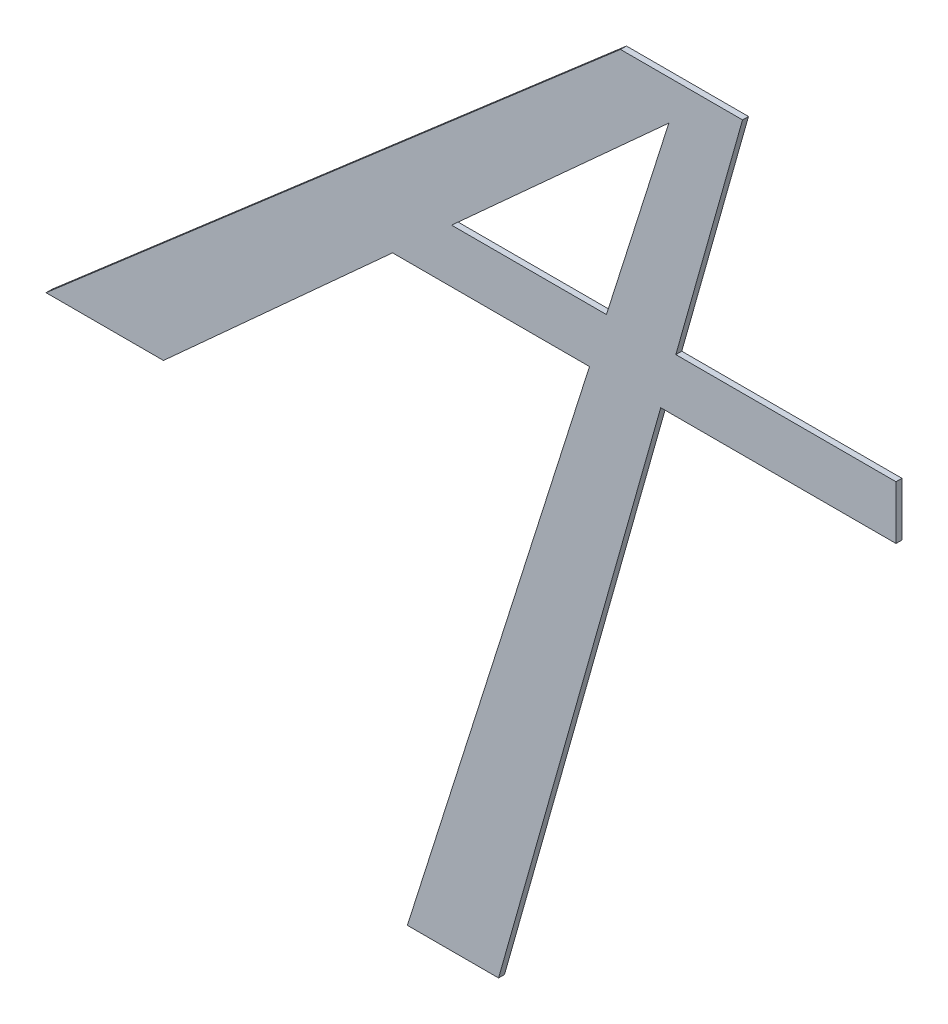
ISO-10303-21;
HEADER;
FILE_DESCRIPTION(('STEP AP214'),'2;1');
FILE_NAME('part.step','',(''),(''),'','','');
FILE_SCHEMA(('AUTOMOTIVE_DESIGN { 1 0 10303 214 1 1 1 1 }'));
ENDSEC;
DATA;
#1=APPLICATION_CONTEXT('core data for automotive mechanical design processes');
#2=APPLICATION_PROTOCOL_DEFINITION('international standard','automotive_design',2000,#1);
#3=PRODUCT_CONTEXT('',#1,'mechanical');
#4=PRODUCT('Part','Part','',(#3));
#5=PRODUCT_RELATED_PRODUCT_CATEGORY('part','',(#4));
#6=PRODUCT_DEFINITION_FORMATION('','',#4);
#7=PRODUCT_DEFINITION_CONTEXT('part definition',#1,'design');
#8=PRODUCT_DEFINITION('design','',#6,#7);
#9=PRODUCT_DEFINITION_SHAPE('','',#8);
#10=(LENGTH_UNIT() NAMED_UNIT(*) SI_UNIT(.MILLI.,.METRE.));
#11=(NAMED_UNIT(*) PLANE_ANGLE_UNIT() SI_UNIT($,.RADIAN.));
#12=(NAMED_UNIT(*) SI_UNIT($,.STERADIAN.) SOLID_ANGLE_UNIT());
#13=UNCERTAINTY_MEASURE_WITH_UNIT(LENGTH_MEASURE(1.E-05),#10,'distance_accuracy_value','');
#14=(GEOMETRIC_REPRESENTATION_CONTEXT(3) GLOBAL_UNCERTAINTY_ASSIGNED_CONTEXT((#13)) GLOBAL_UNIT_ASSIGNED_CONTEXT((#10,
#11,#12)) REPRESENTATION_CONTEXT('',''));
#15=CARTESIAN_POINT('',(0.,0.,0.));
#16=DIRECTION('',(0.,0.,1.));
#17=DIRECTION('',(1.,0.,0.));
#18=AXIS2_PLACEMENT_3D('',#15,#16,#17);
#19=CARTESIAN_POINT('',(0.734443929948458,0.979436457466031,0.));
#20=DIRECTION('',(-0.953321534290562,0.301957037106092,0.));
#21=DIRECTION('',(-0.301957037106092,-0.953321534290562,0.));
#22=AXIS2_PLACEMENT_3D('',#19,#20,#21);
#23=PLANE('',#22);
#24=DIRECTION('',(-0.301957037106092,-0.953321534290562,0.));
#25=VECTOR('',#24,1.);
#26=CARTESIAN_POINT('',(0.734443929948458,0.979436457466031,0.));
#27=LINE('',#26,#25);
#28=CARTESIAN_POINT('',(0.734443929948458,0.979436457466031,0.));
#29=VERTEX_POINT('',#28);
#30=CARTESIAN_POINT('',(0.702959405727164,0.880035313433387,0.));
#31=VERTEX_POINT('',#30);
#32=EDGE_CURVE('E11',#29,#31,#27,.T.);
#33=ORIENTED_EDGE('',*,*,#32,.T.);
#34=DIRECTION('',(0.,0.,1.));
#35=VECTOR('',#34,1.);
#36=CARTESIAN_POINT('',(0.702959405727164,0.880035313433387,0.));
#37=LINE('',#36,#35);
#38=CARTESIAN_POINT('',(0.702959405727164,0.880035313433387,0.003));
#39=VERTEX_POINT('',#38);
#40=EDGE_CURVE('E24',#31,#39,#37,.T.);
#41=ORIENTED_EDGE('',*,*,#40,.T.);
#42=DIRECTION('',(-0.301957037106092,-0.953321534290562,0.));
#43=VECTOR('',#42,1.);
#44=CARTESIAN_POINT('',(0.734443929948458,0.979436457466031,0.003));
#45=LINE('',#44,#43);
#46=CARTESIAN_POINT('',(0.734443929948458,0.979436457466031,0.003));
#47=VERTEX_POINT('',#46);
#48=EDGE_CURVE('E253',#47,#39,#45,.T.);
#49=ORIENTED_EDGE('',*,*,#48,.F.);
#50=DIRECTION('',(0.,0.,1.));
#51=VECTOR('',#50,1.);
#52=CARTESIAN_POINT('',(0.734443929948458,0.979436457466031,0.));
#53=LINE('',#52,#51);
#54=EDGE_CURVE('E250',#29,#47,#53,.T.);
#55=ORIENTED_EDGE('',*,*,#54,.F.);
#56=EDGE_LOOP('',(#33,#41,#49,#55));
#57=FACE_BOUND('',#56,.T.);
#58=ADVANCED_FACE('F17',(#57),#23,.T.);
#59=CARTESIAN_POINT('',(0.624826562522376,0.880035313433387,0.));
#60=DIRECTION('',(0.671743526448324,-0.740783797524467,0.));
#61=DIRECTION('',(0.740783797524467,0.671743526448324,0.));
#62=AXIS2_PLACEMENT_3D('',#59,#60,#61);
#63=PLANE('',#62);
#64=DIRECTION('',(0.740783797524467,0.671743526448324,0.));
#65=VECTOR('',#64,1.);
#66=CARTESIAN_POINT('',(0.624826562522376,0.880035313433387,0.));
#67=LINE('',#66,#65);
#68=CARTESIAN_POINT('',(0.624826562522376,0.880035313433387,0.));
#69=VERTEX_POINT('',#68);
#70=EDGE_CURVE('E247',#69,#29,#67,.T.);
#71=ORIENTED_EDGE('',*,*,#70,.T.);
#72=ORIENTED_EDGE('',*,*,#54,.T.);
#73=DIRECTION('',(0.740783797524467,0.671743526448324,0.));
#74=VECTOR('',#73,1.);
#75=CARTESIAN_POINT('',(0.624826562522376,0.880035313433387,0.003));
#76=LINE('',#75,#74);
#77=CARTESIAN_POINT('',(0.624826562522376,0.880035313433387,0.003));
#78=VERTEX_POINT('',#77);
#79=EDGE_CURVE('E244',#78,#47,#76,.T.);
#80=ORIENTED_EDGE('',*,*,#79,.F.);
#81=DIRECTION('',(0.,0.,1.));
#82=VECTOR('',#81,1.);
#83=CARTESIAN_POINT('',(0.624826562522376,0.880035313433387,0.));
#84=LINE('',#83,#82);
#85=EDGE_CURVE('E241',#69,#78,#84,.T.);
#86=ORIENTED_EDGE('',*,*,#85,.F.);
#87=EDGE_LOOP('',(#71,#72,#80,#86));
#88=FACE_BOUND('',#87,.T.);
#89=ADVANCED_FACE('F260',(#88),#63,.T.);
#90=CARTESIAN_POINT('',(0.702959405727164,0.880035313433387,0.));
#91=DIRECTION('',(0.,1.,0.));
#92=DIRECTION('',(-1.,0.,0.));
#93=AXIS2_PLACEMENT_3D('',#90,#91,#92);
#94=PLANE('',#93);
#95=DIRECTION('',(-1.,0.,0.));
#96=VECTOR('',#95,1.);
#97=CARTESIAN_POINT('',(0.702959405727164,0.880035313433387,0.));
#98=LINE('',#97,#96);
#99=EDGE_CURVE('E238',#31,#69,#98,.T.);
#100=ORIENTED_EDGE('',*,*,#99,.T.);
#101=ORIENTED_EDGE('',*,*,#85,.T.);
#102=DIRECTION('',(-1.,0.,0.));
#103=VECTOR('',#102,1.);
#104=CARTESIAN_POINT('',(0.702959405727164,0.880035313433387,0.003));
#105=LINE('',#104,#103);
#106=EDGE_CURVE('E235',#39,#78,#105,.T.);
#107=ORIENTED_EDGE('',*,*,#106,.F.);
#108=ORIENTED_EDGE('',*,*,#40,.F.);
#109=EDGE_LOOP('',(#100,#101,#107,#108));
#110=FACE_BOUND('',#109,.T.);
#111=ADVANCED_FACE('F257',(#110),#94,.T.);
#112=CARTESIAN_POINT('',(0.420226385774534,0.748221017829747,0.));
#113=DIRECTION('',(0.,-1.,0.));
#114=DIRECTION('',(1.,0.,0.));
#115=AXIS2_PLACEMENT_3D('',#112,#113,#114);
#116=PLANE('',#115);
#117=DIRECTION('',(1.,0.,0.));
#118=VECTOR('',#117,1.);
#119=CARTESIAN_POINT('',(0.420226385774534,0.748221017829747,0.));
#120=LINE('',#119,#118);
#121=CARTESIAN_POINT('',(0.420226385774534,0.748221017829747,0.));
#122=VERTEX_POINT('',#121);
#123=CARTESIAN_POINT('',(0.479464693563916,0.748221017829747,0.));
#124=VERTEX_POINT('',#123);
#125=EDGE_CURVE('E233',#122,#124,#120,.T.);
#126=ORIENTED_EDGE('',*,*,#125,.T.);
#127=DIRECTION('',(0.,0.,1.));
#128=VECTOR('',#127,1.);
#129=CARTESIAN_POINT('',(0.479464693563916,0.748221017829747,0.));
#130=LINE('',#129,#128);
#131=CARTESIAN_POINT('',(0.479464693563916,0.748221017829747,0.003));
#132=VERTEX_POINT('',#131);
#133=EDGE_CURVE('E231',#124,#132,#130,.T.);
#134=ORIENTED_EDGE('',*,*,#133,.T.);
#135=DIRECTION('',(1.,0.,0.));
#136=VECTOR('',#135,1.);
#137=CARTESIAN_POINT('',(0.420226385774534,0.748221017829747,0.003));
#138=LINE('',#137,#136);
#139=CARTESIAN_POINT('',(0.420226385774534,0.748221017829747,0.003));
#140=VERTEX_POINT('',#139);
#141=EDGE_CURVE('E145',#140,#132,#138,.T.);
#142=ORIENTED_EDGE('',*,*,#141,.F.);
#143=DIRECTION('',(0.,0.,1.));
#144=VECTOR('',#143,1.);
#145=CARTESIAN_POINT('',(0.420226385774534,0.748221017829747,0.));
#146=LINE('',#145,#144);
#147=EDGE_CURVE('E227',#122,#140,#146,.T.);
#148=ORIENTED_EDGE('',*,*,#147,.F.);
#149=EDGE_LOOP('',(#126,#134,#142,#148));
#150=FACE_BOUND('',#149,.T.);
#151=ADVANCED_FACE('F277',(#150),#116,.T.);
#152=CARTESIAN_POINT('',(0.71005307485505,0.999422094205851,0.));
#153=DIRECTION('',(-0.65495725832153,0.75566592471273,0.));
#154=DIRECTION('',(-0.75566592471273,-0.65495725832153,0.));
#155=AXIS2_PLACEMENT_3D('',#152,#153,#154);
#156=PLANE('',#155);
#157=DIRECTION('',(-0.75566592471273,-0.65495725832153,0.));
#158=VECTOR('',#157,1.);
#159=CARTESIAN_POINT('',(0.71005307485505,0.999422094205851,0.));
#160=LINE('',#159,#158);
#161=CARTESIAN_POINT('',(0.71005307485505,0.999422094205851,0.));
#162=VERTEX_POINT('',#161);
#163=EDGE_CURVE('E224',#162,#122,#160,.T.);
#164=ORIENTED_EDGE('',*,*,#163,.T.);
#165=ORIENTED_EDGE('',*,*,#147,.T.);
#166=DIRECTION('',(-0.75566592471273,-0.65495725832153,0.));
#167=VECTOR('',#166,1.);
#168=CARTESIAN_POINT('',(0.71005307485505,0.999422094205851,0.003));
#169=LINE('',#168,#167);
#170=CARTESIAN_POINT('',(0.71005307485505,0.999422094205851,0.003));
#171=VERTEX_POINT('',#170);
#172=EDGE_CURVE('E222',#171,#140,#169,.T.);
#173=ORIENTED_EDGE('',*,*,#172,.F.);
#174=DIRECTION('',(0.,0.,1.));
#175=VECTOR('',#174,1.);
#176=CARTESIAN_POINT('',(0.71005307485505,0.999422094205851,0.));
#177=LINE('',#176,#175);
#178=EDGE_CURVE('E219',#162,#171,#177,.T.);
#179=ORIENTED_EDGE('',*,*,#178,.F.);
#180=EDGE_LOOP('',(#164,#165,#173,#179));
#181=FACE_BOUND('',#180,.T.);
#182=ADVANCED_FACE('F282',(#181),#156,.T.);
#183=CARTESIAN_POINT('',(0.771627709888207,0.999422094205851,0.));
#184=DIRECTION('',(0.,1.,0.));
#185=DIRECTION('',(-1.,0.,0.));
#186=AXIS2_PLACEMENT_3D('',#183,#184,#185);
#187=PLANE('',#186);
#188=DIRECTION('',(-1.,0.,0.));
#189=VECTOR('',#188,1.);
#190=CARTESIAN_POINT('',(0.771627709888207,0.999422094205851,0.));
#191=LINE('',#190,#189);
#192=CARTESIAN_POINT('',(0.771627709888207,0.999422094205851,0.));
#193=VERTEX_POINT('',#192);
#194=EDGE_CURVE('E216',#193,#162,#191,.T.);
#195=ORIENTED_EDGE('',*,*,#194,.T.);
#196=ORIENTED_EDGE('',*,*,#178,.T.);
#197=DIRECTION('',(-1.,0.,0.));
#198=VECTOR('',#197,1.);
#199=CARTESIAN_POINT('',(0.771627709888207,0.999422094205851,0.003));
#200=LINE('',#199,#198);
#201=CARTESIAN_POINT('',(0.771627709888207,0.999422094205851,0.003));
#202=VERTEX_POINT('',#201);
#203=EDGE_CURVE('E213',#202,#171,#200,.T.);
#204=ORIENTED_EDGE('',*,*,#203,.F.);
#205=DIRECTION('',(0.,0.,1.));
#206=VECTOR('',#205,1.);
#207=CARTESIAN_POINT('',(0.771627709888207,0.999422094205851,0.));
#208=LINE('',#207,#206);
#209=EDGE_CURVE('E210',#193,#202,#208,.T.);
#210=ORIENTED_EDGE('',*,*,#209,.F.);
#211=EDGE_LOOP('',(#195,#196,#204,#210));
#212=FACE_BOUND('',#211,.T.);
#213=ADVANCED_FACE('F286',(#212),#187,.T.);
#214=CARTESIAN_POINT('',(0.737959586089509,0.880035313433387,0.));
#215=DIRECTION('',(0.962460355588359,-0.271422298127346,0.));
#216=DIRECTION('',(0.271422298127346,0.962460355588359,0.));
#217=AXIS2_PLACEMENT_3D('',#214,#215,#216);
#218=PLANE('',#217);
#219=DIRECTION('',(0.271422298127346,0.962460355588359,0.));
#220=VECTOR('',#219,1.);
#221=CARTESIAN_POINT('',(0.737959586089509,0.880035313433387,0.));
#222=LINE('',#221,#220);
#223=CARTESIAN_POINT('',(0.737959586089509,0.880035313433387,0.));
#224=VERTEX_POINT('',#223);
#225=EDGE_CURVE('E207',#224,#193,#222,.T.);
#226=ORIENTED_EDGE('',*,*,#225,.T.);
#227=ORIENTED_EDGE('',*,*,#209,.T.);
#228=DIRECTION('',(0.271422298127346,0.962460355588359,0.));
#229=VECTOR('',#228,1.);
#230=CARTESIAN_POINT('',(0.737959586089509,0.880035313433387,0.003));
#231=LINE('',#230,#229);
#232=CARTESIAN_POINT('',(0.737959586089509,0.880035313433387,0.003));
#233=VERTEX_POINT('',#232);
#234=EDGE_CURVE('E204',#233,#202,#231,.T.);
#235=ORIENTED_EDGE('',*,*,#234,.F.);
#236=DIRECTION('',(0.,0.,1.));
#237=VECTOR('',#236,1.);
#238=CARTESIAN_POINT('',(0.737959586089509,0.880035313433387,0.));
#239=LINE('',#238,#237);
#240=EDGE_CURVE('E201',#224,#233,#239,.T.);
#241=ORIENTED_EDGE('',*,*,#240,.F.);
#242=EDGE_LOOP('',(#226,#227,#235,#241));
#243=FACE_BOUND('',#242,.T.);
#244=ADVANCED_FACE('F290',(#243),#218,.T.);
#245=CARTESIAN_POINT('',(0.849057169386125,0.880035313433387,0.));
#246=DIRECTION('',(0.,1.,0.));
#247=DIRECTION('',(-1.,0.,0.));
#248=AXIS2_PLACEMENT_3D('',#245,#246,#247);
#249=PLANE('',#248);
#250=DIRECTION('',(-1.,0.,0.));
#251=VECTOR('',#250,1.);
#252=CARTESIAN_POINT('',(0.849057169386125,0.880035313433387,0.));
#253=LINE('',#252,#251);
#254=CARTESIAN_POINT('',(0.849057169386125,0.880035313433387,0.));
#255=VERTEX_POINT('',#254);
#256=EDGE_CURVE('E198',#255,#224,#253,.T.);
#257=ORIENTED_EDGE('',*,*,#256,.T.);
#258=ORIENTED_EDGE('',*,*,#240,.T.);
#259=DIRECTION('',(-1.,0.,0.));
#260=VECTOR('',#259,1.);
#261=CARTESIAN_POINT('',(0.849057169386125,0.880035313433387,0.003));
#262=LINE('',#261,#260);
#263=CARTESIAN_POINT('',(0.849057169386125,0.880035313433387,0.003));
#264=VERTEX_POINT('',#263);
#265=EDGE_CURVE('E195',#264,#233,#262,.T.);
#266=ORIENTED_EDGE('',*,*,#265,.F.);
#267=DIRECTION('',(0.,0.,1.));
#268=VECTOR('',#267,1.);
#269=CARTESIAN_POINT('',(0.849057169386125,0.880035313433387,0.));
#270=LINE('',#269,#268);
#271=EDGE_CURVE('E192',#255,#264,#270,.T.);
#272=ORIENTED_EDGE('',*,*,#271,.F.);
#273=EDGE_LOOP('',(#257,#258,#266,#272));
#274=FACE_BOUND('',#273,.T.);
#275=ADVANCED_FACE('F294',(#274),#249,.T.);
#276=CARTESIAN_POINT('',(0.849057169386125,0.853043530084776,0.));
#277=DIRECTION('',(1.,0.,0.));
#278=DIRECTION('',(0.,1.,0.));
#279=AXIS2_PLACEMENT_3D('',#276,#277,#278);
#280=PLANE('',#279);
#281=DIRECTION('',(0.,1.,0.));
#282=VECTOR('',#281,1.);
#283=CARTESIAN_POINT('',(0.849057169386125,0.853043530084776,0.));
#284=LINE('',#283,#282);
#285=CARTESIAN_POINT('',(0.849057169386125,0.853043530084776,0.));
#286=VERTEX_POINT('',#285);
#287=EDGE_CURVE('E189',#286,#255,#284,.T.);
#288=ORIENTED_EDGE('',*,*,#287,.T.);
#289=ORIENTED_EDGE('',*,*,#271,.T.);
#290=DIRECTION('',(0.,1.,0.));
#291=VECTOR('',#290,1.);
#292=CARTESIAN_POINT('',(0.849057169386125,0.853043530084776,0.003));
#293=LINE('',#292,#291);
#294=CARTESIAN_POINT('',(0.849057169386125,0.853043530084776,0.003));
#295=VERTEX_POINT('',#294);
#296=EDGE_CURVE('E186',#295,#264,#293,.T.);
#297=ORIENTED_EDGE('',*,*,#296,.F.);
#298=DIRECTION('',(0.,0.,1.));
#299=VECTOR('',#298,1.);
#300=CARTESIAN_POINT('',(0.849057169386125,0.853043530084776,0.));
#301=LINE('',#300,#299);
#302=EDGE_CURVE('E183',#286,#295,#301,.T.);
#303=ORIENTED_EDGE('',*,*,#302,.F.);
#304=EDGE_LOOP('',(#288,#289,#297,#303));
#305=FACE_BOUND('',#304,.T.);
#306=ADVANCED_FACE('F298',(#305),#280,.T.);
#307=CARTESIAN_POINT('',(0.730347665427526,0.853043530084776,0.));
#308=DIRECTION('',(0.,-1.,0.));
#309=DIRECTION('',(1.,0.,0.));
#310=AXIS2_PLACEMENT_3D('',#307,#308,#309);
#311=PLANE('',#310);
#312=DIRECTION('',(1.,0.,0.));
#313=VECTOR('',#312,1.);
#314=CARTESIAN_POINT('',(0.730347665427526,0.853043530084776,0.));
#315=LINE('',#314,#313);
#316=CARTESIAN_POINT('',(0.730347665427526,0.853043530084776,0.));
#317=VERTEX_POINT('',#316);
#318=EDGE_CURVE('E180',#317,#286,#315,.T.);
#319=ORIENTED_EDGE('',*,*,#318,.T.);
#320=ORIENTED_EDGE('',*,*,#302,.T.);
#321=DIRECTION('',(1.,0.,0.));
#322=VECTOR('',#321,1.);
#323=CARTESIAN_POINT('',(0.730347665427526,0.853043530084776,0.003));
#324=LINE('',#323,#322);
#325=CARTESIAN_POINT('',(0.730347665427526,0.853043530084776,0.003));
#326=VERTEX_POINT('',#325);
#327=EDGE_CURVE('E177',#326,#295,#324,.T.);
#328=ORIENTED_EDGE('',*,*,#327,.F.);
#329=DIRECTION('',(0.,0.,1.));
#330=VECTOR('',#329,1.);
#331=CARTESIAN_POINT('',(0.730347665427526,0.853043530084776,0.));
#332=LINE('',#331,#330);
#333=EDGE_CURVE('E174',#317,#326,#332,.T.);
#334=ORIENTED_EDGE('',*,*,#333,.F.);
#335=EDGE_LOOP('',(#319,#320,#328,#334));
#336=FACE_BOUND('',#335,.T.);
#337=ADVANCED_FACE('F302',(#336),#311,.T.);
#338=CARTESIAN_POINT('',(0.64853792646181,0.562947134177794,0.));
#339=DIRECTION('',(0.962460355588358,-0.271422298127349,0.));
#340=DIRECTION('',(0.271422298127349,0.962460355588358,0.));
#341=AXIS2_PLACEMENT_3D('',#338,#339,#340);
#342=PLANE('',#341);
#343=DIRECTION('',(0.271422298127349,0.962460355588358,0.));
#344=VECTOR('',#343,1.);
#345=CARTESIAN_POINT('',(0.64853792646181,0.562947134177794,0.));
#346=LINE('',#345,#344);
#347=CARTESIAN_POINT('',(0.64853792646181,0.562947134177794,0.));
#348=VERTEX_POINT('',#347);
#349=EDGE_CURVE('E171',#348,#317,#346,.T.);
#350=ORIENTED_EDGE('',*,*,#349,.T.);
#351=ORIENTED_EDGE('',*,*,#333,.T.);
#352=DIRECTION('',(0.271422298127349,0.962460355588358,0.));
#353=VECTOR('',#352,1.);
#354=CARTESIAN_POINT('',(0.64853792646181,0.562947134177794,0.003));
#355=LINE('',#354,#353);
#356=CARTESIAN_POINT('',(0.64853792646181,0.562947134177794,0.003));
#357=VERTEX_POINT('',#356);
#358=EDGE_CURVE('E168',#357,#326,#355,.T.);
#359=ORIENTED_EDGE('',*,*,#358,.F.);
#360=DIRECTION('',(0.,0.,1.));
#361=VECTOR('',#360,1.);
#362=CARTESIAN_POINT('',(0.64853792646181,0.562947134177794,0.));
#363=LINE('',#362,#361);
#364=EDGE_CURVE('E165',#348,#357,#363,.T.);
#365=ORIENTED_EDGE('',*,*,#364,.F.);
#366=EDGE_LOOP('',(#350,#351,#359,#365));
#367=FACE_BOUND('',#366,.T.);
#368=ADVANCED_FACE('F306',(#367),#342,.T.);
#369=CARTESIAN_POINT('',(0.602524239138127,0.562947134177794,0.));
#370=DIRECTION('',(0.,-1.,0.));
#371=DIRECTION('',(1.,0.,0.));
#372=AXIS2_PLACEMENT_3D('',#369,#370,#371);
#373=PLANE('',#372);
#374=DIRECTION('',(1.,0.,0.));
#375=VECTOR('',#374,1.);
#376=CARTESIAN_POINT('',(0.602524239138127,0.562947134177794,0.));
#377=LINE('',#376,#375);
#378=CARTESIAN_POINT('',(0.602524239138127,0.562947134177794,0.));
#379=VERTEX_POINT('',#378);
#380=EDGE_CURVE('E162',#379,#348,#377,.T.);
#381=ORIENTED_EDGE('',*,*,#380,.T.);
#382=ORIENTED_EDGE('',*,*,#364,.T.);
#383=DIRECTION('',(1.,0.,0.));
#384=VECTOR('',#383,1.);
#385=CARTESIAN_POINT('',(0.602524239138127,0.562947134177794,0.003));
#386=LINE('',#385,#384);
#387=CARTESIAN_POINT('',(0.602524239138127,0.562947134177794,0.003));
#388=VERTEX_POINT('',#387);
#389=EDGE_CURVE('E159',#388,#357,#386,.T.);
#390=ORIENTED_EDGE('',*,*,#389,.F.);
#391=DIRECTION('',(0.,0.,1.));
#392=VECTOR('',#391,1.);
#393=CARTESIAN_POINT('',(0.602524239138127,0.562947134177794,0.));
#394=LINE('',#393,#392);
#395=EDGE_CURVE('E156',#379,#388,#394,.T.);
#396=ORIENTED_EDGE('',*,*,#395,.F.);
#397=EDGE_LOOP('',(#381,#382,#390,#396));
#398=FACE_BOUND('',#397,.T.);
#399=ADVANCED_FACE('F310',(#398),#373,.T.);
#400=CARTESIAN_POINT('',(0.694409972369172,0.853043530084776,0.));
#401=DIRECTION('',(-0.953321534290557,0.301957037106108,0.));
#402=DIRECTION('',(-0.301957037106108,-0.953321534290557,0.));
#403=AXIS2_PLACEMENT_3D('',#400,#401,#402);
#404=PLANE('',#403);
#405=DIRECTION('',(-0.301957037106108,-0.953321534290557,0.));
#406=VECTOR('',#405,1.);
#407=CARTESIAN_POINT('',(0.694409972369172,0.853043530084776,0.));
#408=LINE('',#407,#406);
#409=CARTESIAN_POINT('',(0.694409972369172,0.853043530084776,0.));
#410=VERTEX_POINT('',#409);
#411=EDGE_CURVE('E153',#410,#379,#408,.T.);
#412=ORIENTED_EDGE('',*,*,#411,.T.);
#413=ORIENTED_EDGE('',*,*,#395,.T.);
#414=DIRECTION('',(-0.301957037106108,-0.953321534290557,0.));
#415=VECTOR('',#414,1.);
#416=CARTESIAN_POINT('',(0.694409972369172,0.853043530084776,0.003));
#417=LINE('',#416,#415);
#418=CARTESIAN_POINT('',(0.694409972369172,0.853043530084776,0.003));
#419=VERTEX_POINT('',#418);
#420=EDGE_CURVE('E151',#419,#388,#417,.T.);
#421=ORIENTED_EDGE('',*,*,#420,.F.);
#422=DIRECTION('',(0.,0.,1.));
#423=VECTOR('',#422,1.);
#424=CARTESIAN_POINT('',(0.694409972369172,0.853043530084776,0.));
#425=LINE('',#424,#423);
#426=EDGE_CURVE('E127',#410,#419,#425,.T.);
#427=ORIENTED_EDGE('',*,*,#426,.F.);
#428=EDGE_LOOP('',(#412,#413,#421,#427));
#429=FACE_BOUND('',#428,.T.);
#430=ADVANCED_FACE('F314',(#429),#404,.T.);
#431=CARTESIAN_POINT('',(0.595060625101791,0.853043530084776,0.));
#432=DIRECTION('',(0.,-1.,0.));
#433=DIRECTION('',(1.,0.,0.));
#434=AXIS2_PLACEMENT_3D('',#431,#432,#433);
#435=PLANE('',#434);
#436=DIRECTION('',(1.,0.,0.));
#437=VECTOR('',#436,1.);
#438=CARTESIAN_POINT('',(0.595060625101791,0.853043530084776,0.));
#439=LINE('',#438,#437);
#440=CARTESIAN_POINT('',(0.595060625101791,0.853043530084776,0.));
#441=VERTEX_POINT('',#440);
#442=EDGE_CURVE('E131',#441,#410,#439,.T.);
#443=ORIENTED_EDGE('',*,*,#442,.T.);
#444=ORIENTED_EDGE('',*,*,#426,.T.);
#445=DIRECTION('',(1.,0.,0.));
#446=VECTOR('',#445,1.);
#447=CARTESIAN_POINT('',(0.595060625101791,0.853043530084776,0.003));
#448=LINE('',#447,#446);
#449=CARTESIAN_POINT('',(0.595060625101791,0.853043530084776,0.003));
#450=VERTEX_POINT('',#449);
#451=EDGE_CURVE('E120',#450,#419,#448,.T.);
#452=ORIENTED_EDGE('',*,*,#451,.F.);
#453=DIRECTION('',(0.,0.,1.));
#454=VECTOR('',#453,1.);
#455=CARTESIAN_POINT('',(0.595060625101791,0.853043530084776,0.));
#456=LINE('',#455,#454);
#457=EDGE_CURVE('E124',#441,#450,#456,.T.);
#458=ORIENTED_EDGE('',*,*,#457,.F.);
#459=EDGE_LOOP('',(#443,#444,#452,#458));
#460=FACE_BOUND('',#459,.T.);
#461=ADVANCED_FACE('F123',(#460),#435,.T.);
#462=CARTESIAN_POINT('',(0.479464693563916,0.748221017829747,0.));
#463=DIRECTION('',(0.671743526448345,-0.740783797524448,0.));
#464=DIRECTION('',(0.740783797524448,0.671743526448345,0.));
#465=AXIS2_PLACEMENT_3D('',#462,#463,#464);
#466=PLANE('',#465);
#467=DIRECTION('',(0.740783797524448,0.671743526448345,0.));
#468=VECTOR('',#467,1.);
#469=CARTESIAN_POINT('',(0.479464693563916,0.748221017829747,0.));
#470=LINE('',#469,#468);
#471=EDGE_CURVE('E139',#124,#441,#470,.T.);
#472=ORIENTED_EDGE('',*,*,#471,.T.);
#473=ORIENTED_EDGE('',*,*,#457,.T.);
#474=DIRECTION('',(0.740783797524448,0.671743526448345,0.));
#475=VECTOR('',#474,1.);
#476=CARTESIAN_POINT('',(0.479464693563916,0.748221017829747,0.003));
#477=LINE('',#476,#475);
#478=EDGE_CURVE('E137',#132,#450,#477,.T.);
#479=ORIENTED_EDGE('',*,*,#478,.F.);
#480=ORIENTED_EDGE('',*,*,#133,.F.);
#481=EDGE_LOOP('',(#472,#473,#479,#480));
#482=FACE_BOUND('',#481,.T.);
#483=ADVANCED_FACE('F135',(#482),#466,.T.);
#484=CARTESIAN_POINT('',(0.634641777580329,0.781184614191822,0.003));
#485=DIRECTION('',(0.,0.,1.));
#486=DIRECTION('',(1.,0.,0.));
#487=AXIS2_PLACEMENT_3D('',#484,#485,#486);
#488=PLANE('',#487);
#489=ORIENTED_EDGE('',*,*,#478,.T.);
#490=ORIENTED_EDGE('',*,*,#451,.T.);
#491=ORIENTED_EDGE('',*,*,#420,.T.);
#492=ORIENTED_EDGE('',*,*,#389,.T.);
#493=ORIENTED_EDGE('',*,*,#358,.T.);
#494=ORIENTED_EDGE('',*,*,#327,.T.);
#495=ORIENTED_EDGE('',*,*,#296,.T.);
#496=ORIENTED_EDGE('',*,*,#265,.T.);
#497=ORIENTED_EDGE('',*,*,#234,.T.);
#498=ORIENTED_EDGE('',*,*,#203,.T.);
#499=ORIENTED_EDGE('',*,*,#172,.T.);
#500=ORIENTED_EDGE('',*,*,#141,.T.);
#501=EDGE_LOOP('',(#489,#490,#491,#492,#493,#494,#495,#496,#497,#498,#499,#500));
#502=FACE_BOUND('',#501,.T.);
#503=ORIENTED_EDGE('',*,*,#106,.T.);
#504=ORIENTED_EDGE('',*,*,#79,.T.);
#505=ORIENTED_EDGE('',*,*,#48,.T.);
#506=EDGE_LOOP('',(#503,#504,#505));
#507=FACE_BOUND('',#506,.T.);
#508=ADVANCED_FACE('F142',(#502,#507),#488,.T.);
#509=CARTESIAN_POINT('',(0.634641777580329,0.781184614191822,0.));
#510=DIRECTION('',(0.,0.,1.));
#511=DIRECTION('',(1.,0.,0.));
#512=AXIS2_PLACEMENT_3D('',#509,#510,#511);
#513=PLANE('',#512);
#514=ORIENTED_EDGE('',*,*,#471,.F.);
#515=ORIENTED_EDGE('',*,*,#125,.F.);
#516=ORIENTED_EDGE('',*,*,#163,.F.);
#517=ORIENTED_EDGE('',*,*,#194,.F.);
#518=ORIENTED_EDGE('',*,*,#225,.F.);
#519=ORIENTED_EDGE('',*,*,#256,.F.);
#520=ORIENTED_EDGE('',*,*,#287,.F.);
#521=ORIENTED_EDGE('',*,*,#318,.F.);
#522=ORIENTED_EDGE('',*,*,#349,.F.);
#523=ORIENTED_EDGE('',*,*,#380,.F.);
#524=ORIENTED_EDGE('',*,*,#411,.F.);
#525=ORIENTED_EDGE('',*,*,#442,.F.);
#526=EDGE_LOOP('',(#514,#515,#516,#517,#518,#519,#520,#521,#522,#523,#524,#525));
#527=FACE_BOUND('',#526,.T.);
#528=ORIENTED_EDGE('',*,*,#99,.F.);
#529=ORIENTED_EDGE('',*,*,#32,.F.);
#530=ORIENTED_EDGE('',*,*,#70,.F.);
#531=EDGE_LOOP('',(#528,#529,#530));
#532=FACE_BOUND('',#531,.T.);
#533=ADVANCED_FACE('F261',(#527,#532),#513,.F.);
#534=CLOSED_SHELL('',(#58,#89,#111,#151,#182,#213,#244,#275,#306,#337,#368,#399,#430,#461,#483,
#508,#533));
#535=MANIFOLD_SOLID_BREP('B1',#534);
#536=ADVANCED_BREP_SHAPE_REPRESENTATION('',(#18,#535),#14);
#537=SHAPE_DEFINITION_REPRESENTATION(#9,#536);
ENDSEC;
END-ISO-10303-21;
